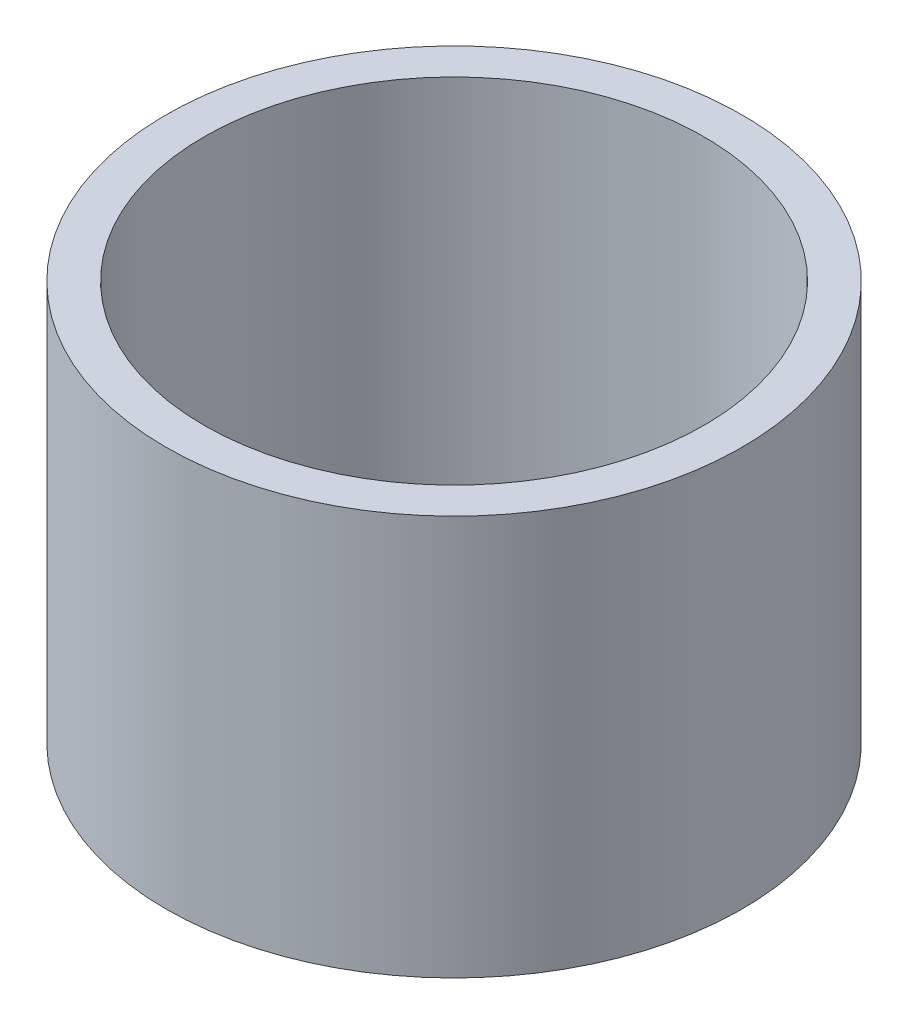
ISO-10303-21;
HEADER;
FILE_DESCRIPTION(('STEP AP214'),'2;1');
FILE_NAME('part.step','',(''),(''),'','','');
FILE_SCHEMA(('AUTOMOTIVE_DESIGN { 1 0 10303 214 1 1 1 1 }'));
ENDSEC;
DATA;
#1=APPLICATION_CONTEXT('core data for automotive mechanical design processes');
#2=APPLICATION_PROTOCOL_DEFINITION('international standard','automotive_design',2000,#1);
#3=PRODUCT_CONTEXT('',#1,'mechanical');
#4=PRODUCT('Part','Part','',(#3));
#5=PRODUCT_RELATED_PRODUCT_CATEGORY('part','',(#4));
#6=PRODUCT_DEFINITION_FORMATION('','',#4);
#7=PRODUCT_DEFINITION_CONTEXT('part definition',#1,'design');
#8=PRODUCT_DEFINITION('design','',#6,#7);
#9=PRODUCT_DEFINITION_SHAPE('','',#8);
#10=(LENGTH_UNIT() NAMED_UNIT(*) SI_UNIT(.MILLI.,.METRE.));
#11=(NAMED_UNIT(*) PLANE_ANGLE_UNIT() SI_UNIT($,.RADIAN.));
#12=(NAMED_UNIT(*) SI_UNIT($,.STERADIAN.) SOLID_ANGLE_UNIT());
#13=UNCERTAINTY_MEASURE_WITH_UNIT(LENGTH_MEASURE(1.E-05),#10,'distance_accuracy_value','');
#14=(GEOMETRIC_REPRESENTATION_CONTEXT(3) GLOBAL_UNCERTAINTY_ASSIGNED_CONTEXT((#13)) GLOBAL_UNIT_ASSIGNED_CONTEXT((#10,
#11,#12)) REPRESENTATION_CONTEXT('',''));
#15=CARTESIAN_POINT('',(0.,0.,0.));
#16=DIRECTION('',(0.,0.,1.));
#17=DIRECTION('',(1.,0.,0.));
#18=AXIS2_PLACEMENT_3D('',#15,#16,#17);
#19=CARTESIAN_POINT('',(0.,5.,0.));
#20=DIRECTION('',(0.,-1.,0.));
#21=DIRECTION('',(0.,0.,-1.));
#22=AXIS2_PLACEMENT_3D('',#19,#20,#21);
#23=CYLINDRICAL_SURFACE('',#22,3.6);
#24=CARTESIAN_POINT('',(0.,5.,0.));
#25=DIRECTION('',(0.,1.,0.));
#26=DIRECTION('',(0.,0.,1.));
#27=AXIS2_PLACEMENT_3D('',#24,#25,#26);
#28=CIRCLE('',#27,3.6);
#29=CARTESIAN_POINT('',(0.,5.,3.6));
#30=VERTEX_POINT('',#29);
#31=EDGE_CURVE('E10',#30,#30,#28,.T.);
#32=ORIENTED_EDGE('',*,*,#31,.F.);
#33=EDGE_LOOP('',(#32));
#34=FACE_BOUND('',#33,.T.);
#35=CARTESIAN_POINT('',(0.,0.,0.));
#36=DIRECTION('',(0.,1.,0.));
#37=DIRECTION('',(0.,0.,1.));
#38=AXIS2_PLACEMENT_3D('',#35,#36,#37);
#39=CIRCLE('',#38,3.6);
#40=CARTESIAN_POINT('',(0.,0.,3.6));
#41=VERTEX_POINT('',#40);
#42=EDGE_CURVE('E46',#41,#41,#39,.T.);
#43=ORIENTED_EDGE('',*,*,#42,.T.);
#44=EDGE_LOOP('',(#43));
#45=FACE_BOUND('',#44,.T.);
#46=ADVANCED_FACE('F43',(#34,#45),#23,.T.);
#47=CARTESIAN_POINT('',(0.,5.,0.));
#48=DIRECTION('',(0.,1.,0.));
#49=DIRECTION('',(0.,0.,1.));
#50=AXIS2_PLACEMENT_3D('',#47,#48,#49);
#51=PLANE('',#50);
#52=CARTESIAN_POINT('',(0.,5.,0.));
#53=DIRECTION('',(0.,1.,0.));
#54=DIRECTION('',(0.,0.,1.));
#55=AXIS2_PLACEMENT_3D('',#52,#53,#54);
#56=CIRCLE('',#55,3.125);
#57=CARTESIAN_POINT('',(0.,5.,3.125));
#58=VERTEX_POINT('',#57);
#59=EDGE_CURVE('E57',#58,#58,#56,.T.);
#60=ORIENTED_EDGE('',*,*,#59,.F.);
#61=EDGE_LOOP('',(#60));
#62=FACE_BOUND('',#61,.T.);
#63=ORIENTED_EDGE('',*,*,#31,.T.);
#64=EDGE_LOOP('',(#63));
#65=FACE_BOUND('',#64,.T.);
#66=ADVANCED_FACE('F74',(#62,#65),#51,.T.);
#67=CARTESIAN_POINT('',(0.,0.,0.));
#68=DIRECTION('',(0.,1.,0.));
#69=DIRECTION('',(0.,0.,1.));
#70=AXIS2_PLACEMENT_3D('',#67,#68,#69);
#71=PLANE('',#70);
#72=ORIENTED_EDGE('',*,*,#42,.F.);
#73=EDGE_LOOP('',(#72));
#74=FACE_BOUND('',#73,.T.);
#75=ADVANCED_FACE('F70',(#74),#71,.F.);
#76=CARTESIAN_POINT('',(0.,0.5,0.));
#77=DIRECTION('',(0.,1.,0.));
#78=DIRECTION('',(0.,0.,1.));
#79=AXIS2_PLACEMENT_3D('',#76,#77,#78);
#80=CYLINDRICAL_SURFACE('',#79,3.125);
#81=CARTESIAN_POINT('',(0.,0.5,0.));
#82=DIRECTION('',(0.,1.,0.));
#83=DIRECTION('',(0.,0.,1.));
#84=AXIS2_PLACEMENT_3D('',#81,#82,#83);
#85=CIRCLE('',#84,3.125);
#86=CARTESIAN_POINT('',(0.,0.5,3.125));
#87=VERTEX_POINT('',#86);
#88=EDGE_CURVE('E55',#87,#87,#85,.T.);
#89=ORIENTED_EDGE('',*,*,#88,.F.);
#90=EDGE_LOOP('',(#89));
#91=FACE_BOUND('',#90,.T.);
#92=ORIENTED_EDGE('',*,*,#59,.T.);
#93=EDGE_LOOP('',(#92));
#94=FACE_BOUND('',#93,.T.);
#95=ADVANCED_FACE('F67',(#91,#94),#80,.F.);
#96=CARTESIAN_POINT('',(0.,0.5,0.));
#97=DIRECTION('',(0.,1.,0.));
#98=DIRECTION('',(0.,0.,1.));
#99=AXIS2_PLACEMENT_3D('',#96,#97,#98);
#100=PLANE('',#99);
#101=ORIENTED_EDGE('',*,*,#88,.T.);
#102=EDGE_LOOP('',(#101));
#103=FACE_BOUND('',#102,.T.);
#104=ADVANCED_FACE('F65',(#103),#100,.T.);
#105=CLOSED_SHELL('',(#46,#66,#75,#95,#104));
#106=MANIFOLD_SOLID_BREP('B2',#105);
#107=ADVANCED_BREP_SHAPE_REPRESENTATION('',(#18,#106),#14);
#108=SHAPE_DEFINITION_REPRESENTATION(#9,#107);
ENDSEC;
END-ISO-10303-21;
